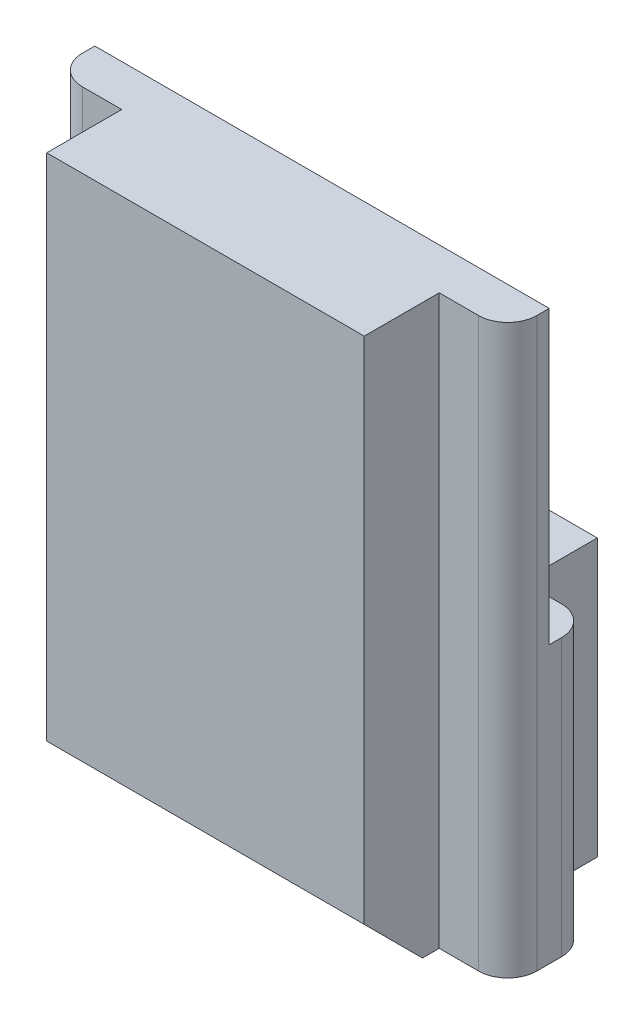
ISO-10303-21;
HEADER;
FILE_DESCRIPTION(('STEP AP214'),'2;1');
FILE_NAME('part.step','',(''),(''),'','','');
FILE_SCHEMA(('AUTOMOTIVE_DESIGN { 1 0 10303 214 1 1 1 1 }'));
ENDSEC;
DATA;
#1=APPLICATION_CONTEXT('core data for automotive mechanical design processes');
#2=APPLICATION_PROTOCOL_DEFINITION('international standard','automotive_design',2000,#1);
#3=PRODUCT_CONTEXT('',#1,'mechanical');
#4=PRODUCT('Part','Part','',(#3));
#5=PRODUCT_RELATED_PRODUCT_CATEGORY('part','',(#4));
#6=PRODUCT_DEFINITION_FORMATION('','',#4);
#7=PRODUCT_DEFINITION_CONTEXT('part definition',#1,'design');
#8=PRODUCT_DEFINITION('design','',#6,#7);
#9=PRODUCT_DEFINITION_SHAPE('','',#8);
#10=(LENGTH_UNIT() NAMED_UNIT(*) SI_UNIT(.MILLI.,.METRE.));
#11=(NAMED_UNIT(*) PLANE_ANGLE_UNIT() SI_UNIT($,.RADIAN.));
#12=(NAMED_UNIT(*) SI_UNIT($,.STERADIAN.) SOLID_ANGLE_UNIT());
#13=UNCERTAINTY_MEASURE_WITH_UNIT(LENGTH_MEASURE(1.E-05),#10,'distance_accuracy_value','');
#14=(GEOMETRIC_REPRESENTATION_CONTEXT(3) GLOBAL_UNCERTAINTY_ASSIGNED_CONTEXT((#13)) GLOBAL_UNIT_ASSIGNED_CONTEXT((#10,
#11,#12)) REPRESENTATION_CONTEXT('',''));
#15=CARTESIAN_POINT('',(0.,0.,0.));
#16=DIRECTION('',(0.,0.,1.));
#17=DIRECTION('',(1.,0.,0.));
#18=AXIS2_PLACEMENT_3D('',#15,#16,#17);
#19=CARTESIAN_POINT('',(0.,19.49,0.));
#20=DIRECTION('',(0.,0.,-1.));
#21=DIRECTION('',(-1.,0.,0.));
#22=AXIS2_PLACEMENT_3D('',#19,#20,#21);
#23=PLANE('',#22);
#24=DIRECTION('',(0.,-1.,0.));
#25=VECTOR('',#24,1.);
#26=CARTESIAN_POINT('',(0.,19.49,0.));
#27=LINE('',#26,#25);
#28=CARTESIAN_POINT('',(0.,19.49,0.));
#29=VERTEX_POINT('',#28);
#30=CARTESIAN_POINT('',(0.,1.99999999999999,0.));
#31=VERTEX_POINT('',#30);
#32=EDGE_CURVE('E295',#29,#31,#27,.T.);
#33=ORIENTED_EDGE('',*,*,#32,.T.);
#34=DIRECTION('',(1.,0.,0.));
#35=VECTOR('',#34,1.);
#36=CARTESIAN_POINT('',(10.9,1.99999999999999,0.));
#37=LINE('',#36,#35);
#38=CARTESIAN_POINT('',(10.9,1.99999999999999,0.));
#39=VERTEX_POINT('',#38);
#40=EDGE_CURVE('E286',#31,#39,#37,.T.);
#41=ORIENTED_EDGE('',*,*,#40,.T.);
#42=DIRECTION('',(0.,-1.,0.));
#43=VECTOR('',#42,1.);
#44=CARTESIAN_POINT('',(10.9,19.49,0.));
#45=LINE('',#44,#43);
#46=CARTESIAN_POINT('',(10.9,19.49,0.));
#47=VERTEX_POINT('',#46);
#48=EDGE_CURVE('E467',#47,#39,#45,.T.);
#49=ORIENTED_EDGE('',*,*,#48,.F.);
#50=DIRECTION('',(1.,0.,0.));
#51=VECTOR('',#50,1.);
#52=CARTESIAN_POINT('',(0.,19.49,0.));
#53=LINE('',#52,#51);
#54=EDGE_CURVE('E348',#29,#47,#53,.T.);
#55=ORIENTED_EDGE('',*,*,#54,.F.);
#56=EDGE_LOOP('',(#33,#41,#49,#55));
#57=FACE_BOUND('',#56,.T.);
#58=ADVANCED_FACE('F81',(#57),#23,.F.);
#59=CARTESIAN_POINT('',(0.,19.49,-8.));
#60=DIRECTION('',(0.,0.,-1.));
#61=DIRECTION('',(-1.,0.,0.));
#62=AXIS2_PLACEMENT_3D('',#59,#60,#61);
#63=PLANE('',#62);
#64=DIRECTION('',(-1.,0.,0.));
#65=VECTOR('',#64,1.);
#66=CARTESIAN_POINT('',(-2.35,9.49,-8.));
#67=LINE('',#66,#65);
#68=CARTESIAN_POINT('',(10.9,9.49,-8.));
#69=VERTEX_POINT('',#68);
#70=CARTESIAN_POINT('',(0.,9.49,-8.));
#71=VERTEX_POINT('',#70);
#72=EDGE_CURVE('E240',#69,#71,#67,.T.);
#73=ORIENTED_EDGE('',*,*,#72,.F.);
#74=DIRECTION('',(0.,-1.,0.));
#75=VECTOR('',#74,1.);
#76=CARTESIAN_POINT('',(10.9,19.49,-8.));
#77=LINE('',#76,#75);
#78=CARTESIAN_POINT('',(10.9,0.,-8.));
#79=VERTEX_POINT('',#78);
#80=EDGE_CURVE('E470',#69,#79,#77,.T.);
#81=ORIENTED_EDGE('',*,*,#80,.T.);
#82=DIRECTION('',(1.,0.,0.));
#83=VECTOR('',#82,1.);
#84=CARTESIAN_POINT('',(0.,0.,-8.));
#85=LINE('',#84,#83);
#86=CARTESIAN_POINT('',(0.,0.,-8.));
#87=VERTEX_POINT('',#86);
#88=EDGE_CURVE('E338',#87,#79,#85,.T.);
#89=ORIENTED_EDGE('',*,*,#88,.F.);
#90=DIRECTION('',(0.,-1.,0.));
#91=VECTOR('',#90,1.);
#92=CARTESIAN_POINT('',(0.,19.49,-8.));
#93=LINE('',#92,#91);
#94=EDGE_CURVE('E345',#71,#87,#93,.T.);
#95=ORIENTED_EDGE('',*,*,#94,.F.);
#96=EDGE_LOOP('',(#73,#81,#89,#95));
#97=FACE_BOUND('',#96,.T.);
#98=ADVANCED_FACE('F402',(#97),#63,.T.);
#99=CARTESIAN_POINT('',(0.,0.,0.));
#100=DIRECTION('',(0.,-1.,0.));
#101=DIRECTION('',(0.,0.,-1.));
#102=AXIS2_PLACEMENT_3D('',#99,#100,#101);
#103=PLANE('',#102);
#104=DIRECTION('',(1.,0.,0.));
#105=VECTOR('',#104,1.);
#106=CARTESIAN_POINT('',(10.9,0.,-5.425));
#107=LINE('',#106,#105);
#108=CARTESIAN_POINT('',(10.9,0.,-5.425));
#109=VERTEX_POINT('',#108);
#110=CARTESIAN_POINT('',(12.25,0.,-5.425));
#111=VERTEX_POINT('',#110);
#112=EDGE_CURVE('E254',#109,#111,#107,.T.);
#113=ORIENTED_EDGE('',*,*,#112,.T.);
#114=CARTESIAN_POINT('',(12.25,0.,-4.425));
#115=DIRECTION('',(0.,-1.,0.));
#116=DIRECTION('',(0.,0.,-1.));
#117=AXIS2_PLACEMENT_3D('',#114,#115,#116);
#118=CIRCLE('',#117,1.);
#119=CARTESIAN_POINT('',(13.25,0.,-4.425));
#120=VERTEX_POINT('',#119);
#121=EDGE_CURVE('E370',#111,#120,#118,.T.);
#122=ORIENTED_EDGE('',*,*,#121,.T.);
#123=DIRECTION('',(0.,0.,-1.));
#124=VECTOR('',#123,1.);
#125=CARTESIAN_POINT('',(13.25,0.,-2.575));
#126=LINE('',#125,#124);
#127=CARTESIAN_POINT('',(13.25,0.,-3.575));
#128=VERTEX_POINT('',#127);
#129=EDGE_CURVE('E303',#128,#120,#126,.T.);
#130=ORIENTED_EDGE('',*,*,#129,.F.);
#131=CARTESIAN_POINT('',(12.25,0.,-3.575));
#132=DIRECTION('',(0.,-1.,0.));
#133=DIRECTION('',(0.,0.,-1.));
#134=AXIS2_PLACEMENT_3D('',#131,#132,#133);
#135=CIRCLE('',#134,1.);
#136=CARTESIAN_POINT('',(12.25,0.,-2.575));
#137=VERTEX_POINT('',#136);
#138=EDGE_CURVE('E359',#128,#137,#135,.T.);
#139=ORIENTED_EDGE('',*,*,#138,.T.);
#140=DIRECTION('',(1.,0.,0.));
#141=VECTOR('',#140,1.);
#142=CARTESIAN_POINT('',(10.9,0.,-2.575));
#143=LINE('',#142,#141);
#144=CARTESIAN_POINT('',(10.9,0.,-2.575));
#145=VERTEX_POINT('',#144);
#146=EDGE_CURVE('E311',#145,#137,#143,.T.);
#147=ORIENTED_EDGE('',*,*,#146,.F.);
#148=DIRECTION('',(0.,0.,-1.));
#149=VECTOR('',#148,1.);
#150=CARTESIAN_POINT('',(10.9,0.,0.));
#151=LINE('',#150,#149);
#152=CARTESIAN_POINT('',(10.9,0.,-2.00000000000001));
#153=VERTEX_POINT('',#152);
#154=EDGE_CURVE('E265',#153,#145,#151,.T.);
#155=ORIENTED_EDGE('',*,*,#154,.F.);
#156=DIRECTION('',(-1.,0.,0.));
#157=VECTOR('',#156,1.);
#158=CARTESIAN_POINT('',(0.,0.,-2.00000000000001));
#159=LINE('',#158,#157);
#160=CARTESIAN_POINT('',(0.,0.,-2.00000000000001));
#161=VERTEX_POINT('',#160);
#162=EDGE_CURVE('E474',#153,#161,#159,.T.);
#163=ORIENTED_EDGE('',*,*,#162,.T.);
#164=DIRECTION('',(0.,0.,-1.));
#165=VECTOR('',#164,1.);
#166=CARTESIAN_POINT('',(0.,0.,0.));
#167=LINE('',#166,#165);
#168=CARTESIAN_POINT('',(0.,0.,-2.575));
#169=VERTEX_POINT('',#168);
#170=EDGE_CURVE('E473',#161,#169,#167,.T.);
#171=ORIENTED_EDGE('',*,*,#170,.T.);
#172=DIRECTION('',(-1.,0.,0.));
#173=VECTOR('',#172,1.);
#174=CARTESIAN_POINT('',(0.,0.,-2.575));
#175=LINE('',#174,#173);
#176=CARTESIAN_POINT('',(-1.35,0.,-2.575));
#177=VERTEX_POINT('',#176);
#178=EDGE_CURVE('E319',#169,#177,#175,.T.);
#179=ORIENTED_EDGE('',*,*,#178,.T.);
#180=CARTESIAN_POINT('',(-1.35,0.,-3.575));
#181=DIRECTION('',(0.,-1.,0.));
#182=DIRECTION('',(0.,0.,-1.));
#183=AXIS2_PLACEMENT_3D('',#180,#181,#182);
#184=CIRCLE('',#183,1.);
#185=CARTESIAN_POINT('',(-2.35,0.,-3.575));
#186=VERTEX_POINT('',#185);
#187=EDGE_CURVE('E364',#177,#186,#184,.T.);
#188=ORIENTED_EDGE('',*,*,#187,.T.);
#189=DIRECTION('',(0.,0.,-1.));
#190=VECTOR('',#189,1.);
#191=CARTESIAN_POINT('',(-2.35,0.,-2.575));
#192=LINE('',#191,#190);
#193=CARTESIAN_POINT('',(-2.35,0.,-4.425));
#194=VERTEX_POINT('',#193);
#195=EDGE_CURVE('E278',#186,#194,#192,.T.);
#196=ORIENTED_EDGE('',*,*,#195,.T.);
#197=CARTESIAN_POINT('',(-1.35,0.,-4.425));
#198=DIRECTION('',(0.,-1.,0.));
#199=DIRECTION('',(0.,0.,-1.));
#200=AXIS2_PLACEMENT_3D('',#197,#198,#199);
#201=CIRCLE('',#200,1.);
#202=CARTESIAN_POINT('',(-1.35,0.,-5.425));
#203=VERTEX_POINT('',#202);
#204=EDGE_CURVE('E365',#194,#203,#201,.T.);
#205=ORIENTED_EDGE('',*,*,#204,.T.);
#206=DIRECTION('',(-1.,0.,0.));
#207=VECTOR('',#206,1.);
#208=CARTESIAN_POINT('',(0.,0.,-5.425));
#209=LINE('',#208,#207);
#210=CARTESIAN_POINT('',(0.,0.,-5.425));
#211=VERTEX_POINT('',#210);
#212=EDGE_CURVE('E308',#211,#203,#209,.T.);
#213=ORIENTED_EDGE('',*,*,#212,.F.);
#214=EDGE_CURVE('E266',#211,#87,#167,.T.);
#215=ORIENTED_EDGE('',*,*,#214,.T.);
#216=ORIENTED_EDGE('',*,*,#88,.T.);
#217=EDGE_CURVE('E333',#109,#79,#151,.T.);
#218=ORIENTED_EDGE('',*,*,#217,.F.);
#219=EDGE_LOOP('',(#113,#122,#130,#139,#147,#155,#163,#171,#179,#188,#196,#205,#213,#215,#216,#218));
#220=FACE_BOUND('',#219,.T.);
#221=ADVANCED_FACE('F356',(#220),#103,.T.);
#222=CARTESIAN_POINT('',(0.,19.49,0.));
#223=DIRECTION('',(0.,-1.,0.));
#224=DIRECTION('',(0.,0.,-1.));
#225=AXIS2_PLACEMENT_3D('',#222,#223,#224);
#226=PLANE('',#225);
#227=DIRECTION('',(0.,0.,-1.));
#228=VECTOR('',#227,1.);
#229=CARTESIAN_POINT('',(-2.35,19.49,-2.575));
#230=LINE('',#229,#228);
#231=CARTESIAN_POINT('',(-2.35,19.49,-3.575));
#232=VERTEX_POINT('',#231);
#233=CARTESIAN_POINT('',(-2.35,19.49,-4.));
#234=VERTEX_POINT('',#233);
#235=EDGE_CURVE('E239',#232,#234,#230,.T.);
#236=ORIENTED_EDGE('',*,*,#235,.F.);
#237=CARTESIAN_POINT('',(-1.35,19.49,-3.575));
#238=DIRECTION('',(0.,-1.,0.));
#239=DIRECTION('',(0.,0.,-1.));
#240=AXIS2_PLACEMENT_3D('',#237,#238,#239);
#241=CIRCLE('',#240,1.);
#242=CARTESIAN_POINT('',(-1.35,19.49,-2.575));
#243=VERTEX_POINT('',#242);
#244=EDGE_CURVE('E89',#232,#243,#241,.F.);
#245=ORIENTED_EDGE('',*,*,#244,.T.);
#246=DIRECTION('',(-1.,0.,0.));
#247=VECTOR('',#246,1.);
#248=CARTESIAN_POINT('',(0.,19.49,-2.575));
#249=LINE('',#248,#247);
#250=CARTESIAN_POINT('',(0.,19.49,-2.575));
#251=VERTEX_POINT('',#250);
#252=EDGE_CURVE('E315',#251,#243,#249,.T.);
#253=ORIENTED_EDGE('',*,*,#252,.F.);
#254=DIRECTION('',(0.,0.,-1.));
#255=VECTOR('',#254,1.);
#256=CARTESIAN_POINT('',(0.,19.49,0.));
#257=LINE('',#256,#255);
#258=EDGE_CURVE('E260',#29,#251,#257,.T.);
#259=ORIENTED_EDGE('',*,*,#258,.F.);
#260=ORIENTED_EDGE('',*,*,#54,.T.);
#261=DIRECTION('',(0.,0.,-1.));
#262=VECTOR('',#261,1.);
#263=CARTESIAN_POINT('',(10.9,19.49,0.));
#264=LINE('',#263,#262);
#265=CARTESIAN_POINT('',(10.9,19.49,-2.575));
#266=VERTEX_POINT('',#265);
#267=EDGE_CURVE('E264',#47,#266,#264,.T.);
#268=ORIENTED_EDGE('',*,*,#267,.T.);
#269=DIRECTION('',(1.,0.,0.));
#270=VECTOR('',#269,1.);
#271=CARTESIAN_POINT('',(10.9,19.49,-2.575));
#272=LINE('',#271,#270);
#273=CARTESIAN_POINT('',(12.25,19.49,-2.575));
#274=VERTEX_POINT('',#273);
#275=EDGE_CURVE('E306',#266,#274,#272,.T.);
#276=ORIENTED_EDGE('',*,*,#275,.T.);
#277=CARTESIAN_POINT('',(12.25,19.49,-3.575));
#278=DIRECTION('',(0.,-1.,0.));
#279=DIRECTION('',(0.,0.,-1.));
#280=AXIS2_PLACEMENT_3D('',#277,#278,#279);
#281=CIRCLE('',#280,1.);
#282=CARTESIAN_POINT('',(13.25,19.49,-3.575));
#283=VERTEX_POINT('',#282);
#284=EDGE_CURVE('E388',#274,#283,#281,.F.);
#285=ORIENTED_EDGE('',*,*,#284,.T.);
#286=DIRECTION('',(0.,0.,-1.));
#287=VECTOR('',#286,1.);
#288=CARTESIAN_POINT('',(13.25,19.49,-2.575));
#289=LINE('',#288,#287);
#290=CARTESIAN_POINT('',(13.25,19.49,-4.));
#291=VERTEX_POINT('',#290);
#292=EDGE_CURVE('E281',#283,#291,#289,.T.);
#293=ORIENTED_EDGE('',*,*,#292,.T.);
#294=DIRECTION('',(1.,0.,0.));
#295=VECTOR('',#294,1.);
#296=CARTESIAN_POINT('',(-2.35,19.49,-4.));
#297=LINE('',#296,#295);
#298=EDGE_CURVE('E226',#234,#291,#297,.T.);
#299=ORIENTED_EDGE('',*,*,#298,.F.);
#300=EDGE_LOOP('',(#236,#245,#253,#259,#260,#268,#276,#285,#293,#299));
#301=FACE_BOUND('',#300,.T.);
#302=ADVANCED_FACE('F391',(#301),#226,.F.);
#303=CARTESIAN_POINT('',(10.9,19.49,0.));
#304=DIRECTION('',(-1.,0.,0.));
#305=DIRECTION('',(0.,0.,1.));
#306=AXIS2_PLACEMENT_3D('',#303,#304,#305);
#307=PLANE('',#306);
#308=ORIENTED_EDGE('',*,*,#80,.F.);
#309=DIRECTION('',(0.,0.,1.));
#310=VECTOR('',#309,1.);
#311=CARTESIAN_POINT('',(10.9,9.49,0.));
#312=LINE('',#311,#310);
#313=CARTESIAN_POINT('',(10.9,9.49,-5.425));
#314=VERTEX_POINT('',#313);
#315=EDGE_CURVE('E251',#69,#314,#312,.T.);
#316=ORIENTED_EDGE('',*,*,#315,.T.);
#317=DIRECTION('',(0.,-1.,0.));
#318=VECTOR('',#317,1.);
#319=CARTESIAN_POINT('',(10.9,19.49,-5.425));
#320=LINE('',#319,#318);
#321=EDGE_CURVE('E292',#314,#109,#320,.T.);
#322=ORIENTED_EDGE('',*,*,#321,.T.);
#323=ORIENTED_EDGE('',*,*,#217,.T.);
#324=EDGE_LOOP('',(#308,#316,#322,#323));
#325=FACE_BOUND('',#324,.T.);
#326=ADVANCED_FACE('F414',(#325),#307,.F.);
#327=ORIENTED_EDGE('',*,*,#48,.T.);
#328=DIRECTION('',(0.,-0.707106781186546,-0.707106781186549));
#329=VECTOR('',#328,1.);
#330=CARTESIAN_POINT('',(10.9,1.99999999999999,0.));
#331=LINE('',#330,#329);
#332=EDGE_CURVE('E330',#39,#153,#331,.T.);
#333=ORIENTED_EDGE('',*,*,#332,.T.);
#334=ORIENTED_EDGE('',*,*,#154,.T.);
#335=DIRECTION('',(0.,-1.,0.));
#336=VECTOR('',#335,1.);
#337=CARTESIAN_POINT('',(10.9,19.49,-2.575));
#338=LINE('',#337,#336);
#339=EDGE_CURVE('E274',#266,#145,#338,.T.);
#340=ORIENTED_EDGE('',*,*,#339,.F.);
#341=ORIENTED_EDGE('',*,*,#267,.F.);
#342=EDGE_LOOP('',(#327,#333,#334,#340,#341));
#343=FACE_BOUND('',#342,.T.);
#344=ADVANCED_FACE('F416',(#343),#307,.F.);
#345=CARTESIAN_POINT('',(0.,19.49,0.));
#346=DIRECTION('',(-1.,0.,0.));
#347=DIRECTION('',(0.,0.,1.));
#348=AXIS2_PLACEMENT_3D('',#345,#346,#347);
#349=PLANE('',#348);
#350=ORIENTED_EDGE('',*,*,#170,.F.);
#351=DIRECTION('',(0.,0.707106781186546,0.707106781186549));
#352=VECTOR('',#351,1.);
#353=CARTESIAN_POINT('',(0.,10.745,8.745));
#354=LINE('',#353,#352);
#355=EDGE_CURVE('E287',#161,#31,#354,.T.);
#356=ORIENTED_EDGE('',*,*,#355,.T.);
#357=ORIENTED_EDGE('',*,*,#32,.F.);
#358=ORIENTED_EDGE('',*,*,#258,.T.);
#359=DIRECTION('',(0.,-1.,0.));
#360=VECTOR('',#359,1.);
#361=CARTESIAN_POINT('',(0.,19.49,-2.575));
#362=LINE('',#361,#360);
#363=EDGE_CURVE('E269',#251,#169,#362,.T.);
#364=ORIENTED_EDGE('',*,*,#363,.T.);
#365=EDGE_LOOP('',(#350,#356,#357,#358,#364));
#366=FACE_BOUND('',#365,.T.);
#367=ADVANCED_FACE('F422',(#366),#349,.T.);
#368=DIRECTION('',(0.,0.,1.));
#369=VECTOR('',#368,1.);
#370=CARTESIAN_POINT('',(0.,9.49,0.));
#371=LINE('',#370,#369);
#372=CARTESIAN_POINT('',(0.,9.49,-5.425));
#373=VERTEX_POINT('',#372);
#374=EDGE_CURVE('E242',#71,#373,#371,.T.);
#375=ORIENTED_EDGE('',*,*,#374,.F.);
#376=ORIENTED_EDGE('',*,*,#94,.T.);
#377=ORIENTED_EDGE('',*,*,#214,.F.);
#378=DIRECTION('',(0.,-1.,0.));
#379=VECTOR('',#378,1.);
#380=CARTESIAN_POINT('',(0.,19.49,-5.425));
#381=LINE('',#380,#379);
#382=EDGE_CURVE('E273',#373,#211,#381,.T.);
#383=ORIENTED_EDGE('',*,*,#382,.F.);
#384=EDGE_LOOP('',(#375,#376,#377,#383));
#385=FACE_BOUND('',#384,.T.);
#386=ADVANCED_FACE('F419',(#385),#349,.T.);
#387=CARTESIAN_POINT('',(13.25,19.49,-2.575));
#388=DIRECTION('',(-1.,0.,0.));
#389=DIRECTION('',(0.,0.,1.));
#390=AXIS2_PLACEMENT_3D('',#387,#388,#389);
#391=PLANE('',#390);
#392=ORIENTED_EDGE('',*,*,#129,.T.);
#393=DIRECTION('',(0.,-1.,0.));
#394=VECTOR('',#393,1.);
#395=CARTESIAN_POINT('',(13.25,9.49,-4.425));
#396=LINE('',#395,#394);
#397=CARTESIAN_POINT('',(13.25,9.49,-4.425));
#398=VERTEX_POINT('',#397);
#399=EDGE_CURVE('E374',#120,#398,#396,.F.);
#400=ORIENTED_EDGE('',*,*,#399,.T.);
#401=DIRECTION('',(0.,0.,-1.));
#402=VECTOR('',#401,1.);
#403=CARTESIAN_POINT('',(13.25,9.49,-4.));
#404=LINE('',#403,#402);
#405=CARTESIAN_POINT('',(13.25,9.49,-4.));
#406=VERTEX_POINT('',#405);
#407=EDGE_CURVE('E236',#406,#398,#404,.T.);
#408=ORIENTED_EDGE('',*,*,#407,.F.);
#409=DIRECTION('',(0.,1.,0.));
#410=VECTOR('',#409,1.);
#411=CARTESIAN_POINT('',(13.25,9.49,-4.));
#412=LINE('',#411,#410);
#413=EDGE_CURVE('E235',#406,#291,#412,.T.);
#414=ORIENTED_EDGE('',*,*,#413,.T.);
#415=ORIENTED_EDGE('',*,*,#292,.F.);
#416=DIRECTION('',(0.,-1.,0.));
#417=VECTOR('',#416,1.);
#418=CARTESIAN_POINT('',(13.25,19.49,-3.575));
#419=LINE('',#418,#417);
#420=EDGE_CURVE('E372',#283,#128,#419,.T.);
#421=ORIENTED_EDGE('',*,*,#420,.T.);
#422=EDGE_LOOP('',(#392,#400,#408,#414,#415,#421));
#423=FACE_BOUND('',#422,.T.);
#424=ADVANCED_FACE('F393',(#423),#391,.F.);
#425=CARTESIAN_POINT('',(10.9,19.49,-5.425));
#426=DIRECTION('',(0.,0.,-1.));
#427=DIRECTION('',(-1.,0.,0.));
#428=AXIS2_PLACEMENT_3D('',#425,#426,#427);
#429=PLANE('',#428);
#430=DIRECTION('',(-1.,0.,0.));
#431=VECTOR('',#430,1.);
#432=CARTESIAN_POINT('',(10.9,9.49,-5.425));
#433=LINE('',#432,#431);
#434=CARTESIAN_POINT('',(12.25,9.49,-5.425));
#435=VERTEX_POINT('',#434);
#436=EDGE_CURVE('E249',#435,#314,#433,.T.);
#437=ORIENTED_EDGE('',*,*,#436,.F.);
#438=DIRECTION('',(0.,-1.,0.));
#439=VECTOR('',#438,1.);
#440=CARTESIAN_POINT('',(12.25,0.,-5.425));
#441=LINE('',#440,#439);
#442=EDGE_CURVE('E291',#435,#111,#441,.T.);
#443=ORIENTED_EDGE('',*,*,#442,.T.);
#444=ORIENTED_EDGE('',*,*,#112,.F.);
#445=ORIENTED_EDGE('',*,*,#321,.F.);
#446=EDGE_LOOP('',(#437,#443,#444,#445));
#447=FACE_BOUND('',#446,.T.);
#448=ADVANCED_FACE('F435',(#447),#429,.T.);
#449=CARTESIAN_POINT('',(10.9,19.49,-2.575));
#450=DIRECTION('',(0.,0.,-1.));
#451=DIRECTION('',(-1.,0.,0.));
#452=AXIS2_PLACEMENT_3D('',#449,#450,#451);
#453=PLANE('',#452);
#454=ORIENTED_EDGE('',*,*,#146,.T.);
#455=DIRECTION('',(0.,-1.,0.));
#456=VECTOR('',#455,1.);
#457=CARTESIAN_POINT('',(12.25,19.49,-2.575));
#458=LINE('',#457,#456);
#459=EDGE_CURVE('E12',#137,#274,#458,.F.);
#460=ORIENTED_EDGE('',*,*,#459,.T.);
#461=ORIENTED_EDGE('',*,*,#275,.F.);
#462=ORIENTED_EDGE('',*,*,#339,.T.);
#463=EDGE_LOOP('',(#454,#460,#461,#462));
#464=FACE_BOUND('',#463,.T.);
#465=ADVANCED_FACE('F351',(#464),#453,.F.);
#466=CARTESIAN_POINT('',(-2.35,19.49,-2.575));
#467=DIRECTION('',(-1.,0.,0.));
#468=DIRECTION('',(0.,0.,1.));
#469=AXIS2_PLACEMENT_3D('',#466,#467,#468);
#470=PLANE('',#469);
#471=DIRECTION('',(0.,0.,1.));
#472=VECTOR('',#471,1.);
#473=CARTESIAN_POINT('',(-2.35,9.49,-4.));
#474=LINE('',#473,#472);
#475=CARTESIAN_POINT('',(-2.35,9.49,-4.425));
#476=VERTEX_POINT('',#475);
#477=CARTESIAN_POINT('',(-2.35,9.49,-4.));
#478=VERTEX_POINT('',#477);
#479=EDGE_CURVE('E213',#476,#478,#474,.T.);
#480=ORIENTED_EDGE('',*,*,#479,.F.);
#481=DIRECTION('',(0.,-1.,0.));
#482=VECTOR('',#481,1.);
#483=CARTESIAN_POINT('',(-2.35,0.,-4.425));
#484=LINE('',#483,#482);
#485=EDGE_CURVE('E381',#476,#194,#484,.T.);
#486=ORIENTED_EDGE('',*,*,#485,.T.);
#487=ORIENTED_EDGE('',*,*,#195,.F.);
#488=DIRECTION('',(0.,-1.,0.));
#489=VECTOR('',#488,1.);
#490=CARTESIAN_POINT('',(-2.35,19.49,-3.575));
#491=LINE('',#490,#489);
#492=EDGE_CURVE('E379',#186,#232,#491,.F.);
#493=ORIENTED_EDGE('',*,*,#492,.T.);
#494=ORIENTED_EDGE('',*,*,#235,.T.);
#495=DIRECTION('',(0.,1.,0.));
#496=VECTOR('',#495,1.);
#497=CARTESIAN_POINT('',(-2.35,9.49,-4.));
#498=LINE('',#497,#496);
#499=EDGE_CURVE('E232',#478,#234,#498,.T.);
#500=ORIENTED_EDGE('',*,*,#499,.F.);
#501=EDGE_LOOP('',(#480,#486,#487,#493,#494,#500));
#502=FACE_BOUND('',#501,.T.);
#503=ADVANCED_FACE('F238',(#502),#470,.T.);
#504=CARTESIAN_POINT('',(0.,19.49,-2.575));
#505=DIRECTION('',(0.,0.,1.));
#506=DIRECTION('',(1.,0.,0.));
#507=AXIS2_PLACEMENT_3D('',#504,#505,#506);
#508=PLANE('',#507);
#509=ORIENTED_EDGE('',*,*,#252,.T.);
#510=DIRECTION('',(0.,-1.,0.));
#511=VECTOR('',#510,1.);
#512=CARTESIAN_POINT('',(-1.35,19.49,-2.575));
#513=LINE('',#512,#511);
#514=EDGE_CURVE('E385',#243,#177,#513,.T.);
#515=ORIENTED_EDGE('',*,*,#514,.T.);
#516=ORIENTED_EDGE('',*,*,#178,.F.);
#517=ORIENTED_EDGE('',*,*,#363,.F.);
#518=EDGE_LOOP('',(#509,#515,#516,#517));
#519=FACE_BOUND('',#518,.T.);
#520=ADVANCED_FACE('F424',(#519),#508,.T.);
#521=CARTESIAN_POINT('',(0.,19.49,-5.425));
#522=DIRECTION('',(0.,0.,1.));
#523=DIRECTION('',(1.,0.,0.));
#524=AXIS2_PLACEMENT_3D('',#521,#522,#523);
#525=PLANE('',#524);
#526=ORIENTED_EDGE('',*,*,#212,.T.);
#527=DIRECTION('',(0.,-1.,0.));
#528=VECTOR('',#527,1.);
#529=CARTESIAN_POINT('',(-1.35,9.49,-5.425));
#530=LINE('',#529,#528);
#531=CARTESIAN_POINT('',(-1.35,9.49,-5.425));
#532=VERTEX_POINT('',#531);
#533=EDGE_CURVE('E383',#203,#532,#530,.F.);
#534=ORIENTED_EDGE('',*,*,#533,.T.);
#535=DIRECTION('',(1.,0.,0.));
#536=VECTOR('',#535,1.);
#537=CARTESIAN_POINT('',(0.,9.49,-5.425));
#538=LINE('',#537,#536);
#539=EDGE_CURVE('E289',#532,#373,#538,.T.);
#540=ORIENTED_EDGE('',*,*,#539,.T.);
#541=ORIENTED_EDGE('',*,*,#382,.T.);
#542=EDGE_LOOP('',(#526,#534,#540,#541));
#543=FACE_BOUND('',#542,.T.);
#544=ADVANCED_FACE('F427',(#543),#525,.F.);
#545=CARTESIAN_POINT('',(0.,1.99999999999999,0.));
#546=DIRECTION('',(0.,-0.707106781186549,0.707106781186546));
#547=DIRECTION('',(-1.,0.,0.));
#548=AXIS2_PLACEMENT_3D('',#545,#546,#547);
#549=PLANE('',#548);
#550=ORIENTED_EDGE('',*,*,#355,.F.);
#551=ORIENTED_EDGE('',*,*,#162,.F.);
#552=ORIENTED_EDGE('',*,*,#332,.F.);
#553=ORIENTED_EDGE('',*,*,#40,.F.);
#554=EDGE_LOOP('',(#550,#551,#552,#553));
#555=FACE_BOUND('',#554,.T.);
#556=ADVANCED_FACE('F429',(#555),#549,.T.);
#557=CARTESIAN_POINT('',(0.,9.49,0.));
#558=DIRECTION('',(0.,-1.,0.));
#559=DIRECTION('',(0.,0.,-1.));
#560=AXIS2_PLACEMENT_3D('',#557,#558,#559);
#561=PLANE('',#560);
#562=ORIENTED_EDGE('',*,*,#407,.T.);
#563=CARTESIAN_POINT('',(12.25,9.49,-4.425));
#564=DIRECTION('',(0.,-1.,0.));
#565=DIRECTION('',(0.,0.,-1.));
#566=AXIS2_PLACEMENT_3D('',#563,#564,#565);
#567=CIRCLE('',#566,1.);
#568=EDGE_CURVE('E377',#398,#435,#567,.F.);
#569=ORIENTED_EDGE('',*,*,#568,.T.);
#570=ORIENTED_EDGE('',*,*,#436,.T.);
#571=ORIENTED_EDGE('',*,*,#315,.F.);
#572=ORIENTED_EDGE('',*,*,#72,.T.);
#573=ORIENTED_EDGE('',*,*,#374,.T.);
#574=ORIENTED_EDGE('',*,*,#539,.F.);
#575=CARTESIAN_POINT('',(-1.35,9.49,-4.425));
#576=DIRECTION('',(0.,-1.,0.));
#577=DIRECTION('',(0.,0.,-1.));
#578=AXIS2_PLACEMENT_3D('',#575,#576,#577);
#579=CIRCLE('',#578,1.);
#580=EDGE_CURVE('E221',#532,#476,#579,.F.);
#581=ORIENTED_EDGE('',*,*,#580,.T.);
#582=ORIENTED_EDGE('',*,*,#479,.T.);
#583=DIRECTION('',(1.,0.,0.));
#584=VECTOR('',#583,1.);
#585=CARTESIAN_POINT('',(-2.35,9.49,-4.));
#586=LINE('',#585,#584);
#587=EDGE_CURVE('E217',#478,#406,#586,.T.);
#588=ORIENTED_EDGE('',*,*,#587,.T.);
#589=EDGE_LOOP('',(#562,#569,#570,#571,#572,#573,#574,#581,#582,#588));
#590=FACE_BOUND('',#589,.T.);
#591=ADVANCED_FACE('F216',(#590),#561,.F.);
#592=CARTESIAN_POINT('',(-2.35,9.49,-4.));
#593=DIRECTION('',(0.,0.,1.));
#594=DIRECTION('',(1.,0.,0.));
#595=AXIS2_PLACEMENT_3D('',#592,#593,#594);
#596=PLANE('',#595);
#597=ORIENTED_EDGE('',*,*,#298,.T.);
#598=ORIENTED_EDGE('',*,*,#413,.F.);
#599=ORIENTED_EDGE('',*,*,#587,.F.);
#600=ORIENTED_EDGE('',*,*,#499,.T.);
#601=EDGE_LOOP('',(#597,#598,#599,#600));
#602=FACE_BOUND('',#601,.T.);
#603=ADVANCED_FACE('F231',(#602),#596,.F.);
#604=CARTESIAN_POINT('',(12.25,19.49,-4.425));
#605=DIRECTION('',(0.,1.,0.));
#606=DIRECTION('',(0.,0.,1.));
#607=AXIS2_PLACEMENT_3D('',#604,#605,#606);
#608=CYLINDRICAL_SURFACE('',#607,1.);
#609=ORIENTED_EDGE('',*,*,#568,.F.);
#610=ORIENTED_EDGE('',*,*,#399,.F.);
#611=ORIENTED_EDGE('',*,*,#121,.F.);
#612=ORIENTED_EDGE('',*,*,#442,.F.);
#613=EDGE_LOOP('',(#609,#610,#611,#612));
#614=FACE_BOUND('',#613,.T.);
#615=ADVANCED_FACE('F446',(#614),#608,.T.);
#616=CARTESIAN_POINT('',(-1.35,19.49,-4.425));
#617=DIRECTION('',(0.,1.,0.));
#618=DIRECTION('',(0.,0.,1.));
#619=AXIS2_PLACEMENT_3D('',#616,#617,#618);
#620=CYLINDRICAL_SURFACE('',#619,1.);
#621=ORIENTED_EDGE('',*,*,#580,.F.);
#622=ORIENTED_EDGE('',*,*,#533,.F.);
#623=ORIENTED_EDGE('',*,*,#204,.F.);
#624=ORIENTED_EDGE('',*,*,#485,.F.);
#625=EDGE_LOOP('',(#621,#622,#623,#624));
#626=FACE_BOUND('',#625,.T.);
#627=ADVANCED_FACE('F399',(#626),#620,.T.);
#628=CARTESIAN_POINT('',(-1.35,19.49,-3.575));
#629=DIRECTION('',(0.,-1.,0.));
#630=DIRECTION('',(0.,0.,-1.));
#631=AXIS2_PLACEMENT_3D('',#628,#629,#630);
#632=CYLINDRICAL_SURFACE('',#631,1.);
#633=ORIENTED_EDGE('',*,*,#244,.F.);
#634=ORIENTED_EDGE('',*,*,#492,.F.);
#635=ORIENTED_EDGE('',*,*,#187,.F.);
#636=ORIENTED_EDGE('',*,*,#514,.F.);
#637=EDGE_LOOP('',(#633,#634,#635,#636));
#638=FACE_BOUND('',#637,.T.);
#639=ADVANCED_FACE('F395',(#638),#632,.T.);
#640=CARTESIAN_POINT('',(12.25,19.49,-3.575));
#641=DIRECTION('',(0.,-1.,0.));
#642=DIRECTION('',(0.,0.,-1.));
#643=AXIS2_PLACEMENT_3D('',#640,#641,#642);
#644=CYLINDRICAL_SURFACE('',#643,1.);
#645=ORIENTED_EDGE('',*,*,#284,.F.);
#646=ORIENTED_EDGE('',*,*,#459,.F.);
#647=ORIENTED_EDGE('',*,*,#138,.F.);
#648=ORIENTED_EDGE('',*,*,#420,.F.);
#649=EDGE_LOOP('',(#645,#646,#647,#648));
#650=FACE_BOUND('',#649,.T.);
#651=ADVANCED_FACE('F83',(#650),#644,.T.);
#652=CLOSED_SHELL('',(#58,#98,#221,#302,#326,#344,#367,#386,#424,#448,#465,#503,#520,#544,#556,
#591,#603,#615,#627,#639,#651));
#653=MANIFOLD_SOLID_BREP('B2',#652);
#654=ADVANCED_BREP_SHAPE_REPRESENTATION('',(#18,#653),#14);
#655=SHAPE_DEFINITION_REPRESENTATION(#9,#654);
ENDSEC;
END-ISO-10303-21;
